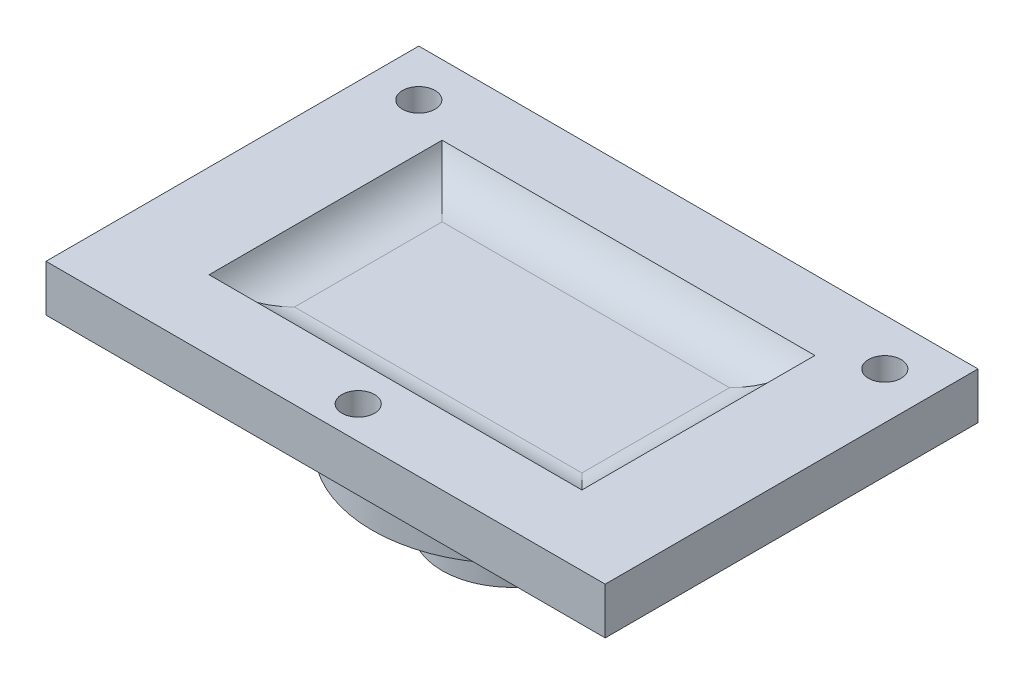
ISO-10303-21;
HEADER;
FILE_DESCRIPTION(('STEP AP214'),'2;1');
FILE_NAME('part.step','',(''),(''),'','','');
FILE_SCHEMA(('AUTOMOTIVE_DESIGN { 1 0 10303 214 1 1 1 1 }'));
ENDSEC;
DATA;
#1=APPLICATION_CONTEXT('core data for automotive mechanical design processes');
#2=APPLICATION_PROTOCOL_DEFINITION('international standard','automotive_design',2000,#1);
#3=PRODUCT_CONTEXT('',#1,'mechanical');
#4=PRODUCT('Part','Part','',(#3));
#5=PRODUCT_RELATED_PRODUCT_CATEGORY('part','',(#4));
#6=PRODUCT_DEFINITION_FORMATION('','',#4);
#7=PRODUCT_DEFINITION_CONTEXT('part definition',#1,'design');
#8=PRODUCT_DEFINITION('design','',#6,#7);
#9=PRODUCT_DEFINITION_SHAPE('','',#8);
#10=(LENGTH_UNIT() NAMED_UNIT(*) SI_UNIT(.MILLI.,.METRE.));
#11=(NAMED_UNIT(*) PLANE_ANGLE_UNIT() SI_UNIT($,.RADIAN.));
#12=(NAMED_UNIT(*) SI_UNIT($,.STERADIAN.) SOLID_ANGLE_UNIT());
#13=UNCERTAINTY_MEASURE_WITH_UNIT(LENGTH_MEASURE(1.E-05),#10,'distance_accuracy_value','');
#14=(GEOMETRIC_REPRESENTATION_CONTEXT(3) GLOBAL_UNCERTAINTY_ASSIGNED_CONTEXT((#13)) GLOBAL_UNIT_ASSIGNED_CONTEXT((#10,
#11,#12)) REPRESENTATION_CONTEXT('',''));
#15=CARTESIAN_POINT('',(0.,0.,0.));
#16=DIRECTION('',(0.,0.,1.));
#17=DIRECTION('',(1.,0.,0.));
#18=AXIS2_PLACEMENT_3D('',#15,#16,#17);
#19=CARTESIAN_POINT('',(39.2808364101075,-30.0000000000003,-1.14620291727828E-12));
#20=DIRECTION('',(0.,-1.,0.));
#21=DIRECTION('',(0.,0.,-1.));
#22=AXIS2_PLACEMENT_3D('',#19,#20,#21);
#23=PLANE('',#22);
#24=CARTESIAN_POINT('',(39.2808364101075,-30.,10.118912604795));
#25=DIRECTION('',(0.,1.,0.));
#26=DIRECTION('',(0.,0.,1.));
#27=AXIS2_PLACEMENT_3D('',#24,#25,#26);
#28=CIRCLE('',#27,15.);
#29=CARTESIAN_POINT('',(39.2808364101075,-30.0000000000001,25.1189126047949));
#30=VERTEX_POINT('',#29);
#31=EDGE_CURVE('E11',#30,#30,#28,.T.);
#32=ORIENTED_EDGE('',*,*,#31,.F.);
#33=EDGE_LOOP('',(#32));
#34=FACE_BOUND('',#33,.T.);
#35=ADVANCED_FACE('F51',(#34),#23,.T.);
#36=CARTESIAN_POINT('',(39.2808364101075,27.7078151186478,10.1189126047951));
#37=DIRECTION('',(0.,1.,0.));
#38=DIRECTION('',(0.,0.,1.));
#39=AXIS2_PLACEMENT_3D('',#36,#37,#38);
#40=CYLINDRICAL_SURFACE('',#39,15.);
#41=ORIENTED_EDGE('',*,*,#31,.T.);
#42=EDGE_LOOP('',(#41));
#43=FACE_BOUND('',#42,.T.);
#44=CARTESIAN_POINT('',(39.2808364101075,-15.,10.118912604795));
#45=DIRECTION('',(0.,1.,0.));
#46=DIRECTION('',(0.,0.,1.));
#47=AXIS2_PLACEMENT_3D('',#44,#45,#46);
#48=CIRCLE('',#47,15.);
#49=CARTESIAN_POINT('',(39.2808364101075,-15.0000000000001,25.118912604795));
#50=VERTEX_POINT('',#49);
#51=EDGE_CURVE('E57',#50,#50,#48,.T.);
#52=ORIENTED_EDGE('',*,*,#51,.F.);
#53=EDGE_LOOP('',(#52));
#54=FACE_BOUND('',#53,.T.);
#55=ADVANCED_FACE('F83',(#43,#54),#40,.T.);
#56=CARTESIAN_POINT('',(39.2808364101075,-15.,0.));
#57=DIRECTION('',(0.,-1.,0.));
#58=DIRECTION('',(0.,0.,-1.));
#59=AXIS2_PLACEMENT_3D('',#56,#57,#58);
#60=PLANE('',#59);
#61=ORIENTED_EDGE('',*,*,#51,.T.);
#62=EDGE_LOOP('',(#61));
#63=FACE_BOUND('',#62,.T.);
#64=CARTESIAN_POINT('',(39.2808364101075,-15.0000000000001,10.118912604795));
#65=DIRECTION('',(0.,1.,0.));
#66=DIRECTION('',(0.,0.,1.));
#67=AXIS2_PLACEMENT_3D('',#64,#65,#66);
#68=CIRCLE('',#67,29.9999999999999);
#69=CARTESIAN_POINT('',(39.2808364101075,-15.0000000000001,40.1189126047949));
#70=VERTEX_POINT('',#69);
#71=EDGE_CURVE('E61',#70,#70,#68,.T.);
#72=ORIENTED_EDGE('',*,*,#71,.F.);
#73=EDGE_LOOP('',(#72));
#74=FACE_BOUND('',#73,.T.);
#75=ADVANCED_FACE('F75',(#63,#74),#60,.T.);
#76=CARTESIAN_POINT('',(39.2808364101075,27.7078151186478,10.1189126047951));
#77=DIRECTION('',(0.,1.,0.));
#78=DIRECTION('',(0.,0.,1.));
#79=AXIS2_PLACEMENT_3D('',#76,#77,#78);
#80=CYLINDRICAL_SURFACE('',#79,29.9999999999999);
#81=ORIENTED_EDGE('',*,*,#71,.T.);
#82=EDGE_LOOP('',(#81));
#83=FACE_BOUND('',#82,.T.);
#84=CARTESIAN_POINT('',(39.2808364101075,0.,10.118912604795));
#85=DIRECTION('',(0.,1.,0.));
#86=DIRECTION('',(0.,0.,1.));
#87=AXIS2_PLACEMENT_3D('',#84,#85,#86);
#88=CIRCLE('',#87,29.9999999999999);
#89=CARTESIAN_POINT('',(39.2808364101075,-1.04100264772111E-13,40.118912604795));
#90=VERTEX_POINT('',#89);
#91=EDGE_CURVE('E65',#90,#90,#88,.T.);
#92=ORIENTED_EDGE('',*,*,#91,.F.);
#93=EDGE_LOOP('',(#92));
#94=FACE_BOUND('',#93,.T.);
#95=ADVANCED_FACE('F73',(#83,#94),#80,.T.);
#96=CARTESIAN_POINT('',(39.2808364101075,0.,0.));
#97=DIRECTION('',(0.,-1.,0.));
#98=DIRECTION('',(0.,0.,-1.));
#99=AXIS2_PLACEMENT_3D('',#96,#97,#98);
#100=PLANE('',#99);
#101=ORIENTED_EDGE('',*,*,#91,.T.);
#102=EDGE_LOOP('',(#101));
#103=FACE_BOUND('',#102,.T.);
#104=ADVANCED_FACE('F71',(#103),#100,.F.);
#105=CLOSED_SHELL('',(#35,#55,#75,#95,#104));
#106=MANIFOLD_SOLID_BREP('B2',#105);
#107=CARTESIAN_POINT('',(-20.7191635898925,10.,-29.881087395205));
#108=DIRECTION('',(1.,0.,0.));
#109=DIRECTION('',(0.,0.,-1.));
#110=AXIS2_PLACEMENT_3D('',#107,#108,#109);
#111=PLANE('',#110);
#112=DIRECTION('',(0.,0.,1.));
#113=VECTOR('',#112,1.);
#114=CARTESIAN_POINT('',(-20.7191635898925,0.,-29.881087395205));
#115=LINE('',#114,#113);
#116=CARTESIAN_POINT('',(-20.7191635898925,0.,-29.881087395205));
#117=VERTEX_POINT('',#116);
#118=CARTESIAN_POINT('',(-20.7191635898925,0.,50.118912604795));
#119=VERTEX_POINT('',#118);
#120=EDGE_CURVE('E225',#117,#119,#115,.T.);
#121=ORIENTED_EDGE('',*,*,#120,.T.);
#122=DIRECTION('',(0.,-1.,0.));
#123=VECTOR('',#122,1.);
#124=CARTESIAN_POINT('',(-20.7191635898925,10.,50.118912604795));
#125=LINE('',#124,#123);
#126=CARTESIAN_POINT('',(-20.7191635898925,10.,50.118912604795));
#127=VERTEX_POINT('',#126);
#128=EDGE_CURVE('E252',#127,#119,#125,.T.);
#129=ORIENTED_EDGE('',*,*,#128,.F.);
#130=DIRECTION('',(0.,0.,1.));
#131=VECTOR('',#130,1.);
#132=CARTESIAN_POINT('',(-20.7191635898925,10.,-29.881087395205));
#133=LINE('',#132,#131);
#134=CARTESIAN_POINT('',(-20.7191635898925,10.,-29.881087395205));
#135=VERTEX_POINT('',#134);
#136=EDGE_CURVE('E226',#135,#127,#133,.T.);
#137=ORIENTED_EDGE('',*,*,#136,.F.);
#138=DIRECTION('',(0.,-1.,0.));
#139=VECTOR('',#138,1.);
#140=CARTESIAN_POINT('',(-20.7191635898925,10.,-29.881087395205));
#141=LINE('',#140,#139);
#142=EDGE_CURVE('E236',#135,#117,#141,.T.);
#143=ORIENTED_EDGE('',*,*,#142,.T.);
#144=EDGE_LOOP('',(#121,#129,#137,#143));
#145=FACE_BOUND('',#144,.T.);
#146=ADVANCED_FACE('F125',(#145),#111,.F.);
#147=CARTESIAN_POINT('',(-20.7191635898925,10.,50.118912604795));
#148=DIRECTION('',(0.,0.,-1.));
#149=DIRECTION('',(-1.,0.,0.));
#150=AXIS2_PLACEMENT_3D('',#147,#148,#149);
#151=PLANE('',#150);
#152=DIRECTION('',(1.,0.,0.));
#153=VECTOR('',#152,1.);
#154=CARTESIAN_POINT('',(-20.7191635898925,0.,50.118912604795));
#155=LINE('',#154,#153);
#156=CARTESIAN_POINT('',(99.2808364101075,0.,50.118912604795));
#157=VERTEX_POINT('',#156);
#158=EDGE_CURVE('E239',#119,#157,#155,.T.);
#159=ORIENTED_EDGE('',*,*,#158,.T.);
#160=DIRECTION('',(0.,-1.,0.));
#161=VECTOR('',#160,1.);
#162=CARTESIAN_POINT('',(99.2808364101075,10.,50.118912604795));
#163=LINE('',#162,#161);
#164=CARTESIAN_POINT('',(99.2808364101075,10.,50.118912604795));
#165=VERTEX_POINT('',#164);
#166=EDGE_CURVE('E249',#165,#157,#163,.T.);
#167=ORIENTED_EDGE('',*,*,#166,.F.);
#168=DIRECTION('',(1.,0.,0.));
#169=VECTOR('',#168,1.);
#170=CARTESIAN_POINT('',(-20.7191635898925,10.,50.118912604795));
#171=LINE('',#170,#169);
#172=EDGE_CURVE('E229',#127,#165,#171,.T.);
#173=ORIENTED_EDGE('',*,*,#172,.F.);
#174=ORIENTED_EDGE('',*,*,#128,.T.);
#175=EDGE_LOOP('',(#159,#167,#173,#174));
#176=FACE_BOUND('',#175,.T.);
#177=ADVANCED_FACE('F268',(#176),#151,.F.);
#178=CARTESIAN_POINT('',(99.2808364101075,10.,-29.881087395205));
#179=DIRECTION('',(-1.,0.,0.));
#180=DIRECTION('',(0.,0.,1.));
#181=AXIS2_PLACEMENT_3D('',#178,#179,#180);
#182=PLANE('',#181);
#183=DIRECTION('',(0.,0.,-1.));
#184=VECTOR('',#183,1.);
#185=CARTESIAN_POINT('',(99.2808364101075,0.,-29.881087395205));
#186=LINE('',#185,#184);
#187=CARTESIAN_POINT('',(99.2808364101075,0.,-29.881087395205));
#188=VERTEX_POINT('',#187);
#189=EDGE_CURVE('E241',#157,#188,#186,.T.);
#190=ORIENTED_EDGE('',*,*,#189,.T.);
#191=DIRECTION('',(0.,-1.,0.));
#192=VECTOR('',#191,1.);
#193=CARTESIAN_POINT('',(99.2808364101075,10.,-29.881087395205));
#194=LINE('',#193,#192);
#195=CARTESIAN_POINT('',(99.2808364101075,10.,-29.881087395205));
#196=VERTEX_POINT('',#195);
#197=EDGE_CURVE('E246',#196,#188,#194,.T.);
#198=ORIENTED_EDGE('',*,*,#197,.F.);
#199=DIRECTION('',(0.,0.,-1.));
#200=VECTOR('',#199,1.);
#201=CARTESIAN_POINT('',(99.2808364101075,10.,-29.881087395205));
#202=LINE('',#201,#200);
#203=EDGE_CURVE('E232',#165,#196,#202,.T.);
#204=ORIENTED_EDGE('',*,*,#203,.F.);
#205=ORIENTED_EDGE('',*,*,#166,.T.);
#206=EDGE_LOOP('',(#190,#198,#204,#205));
#207=FACE_BOUND('',#206,.T.);
#208=ADVANCED_FACE('F274',(#207),#182,.F.);
#209=CARTESIAN_POINT('',(-20.7191635898925,10.,-29.881087395205));
#210=DIRECTION('',(0.,0.,1.));
#211=DIRECTION('',(1.,0.,0.));
#212=AXIS2_PLACEMENT_3D('',#209,#210,#211);
#213=PLANE('',#212);
#214=DIRECTION('',(-1.,0.,0.));
#215=VECTOR('',#214,1.);
#216=CARTESIAN_POINT('',(-20.7191635898925,0.,-29.881087395205));
#217=LINE('',#216,#215);
#218=EDGE_CURVE('E230',#188,#117,#217,.T.);
#219=ORIENTED_EDGE('',*,*,#218,.T.);
#220=ORIENTED_EDGE('',*,*,#142,.F.);
#221=DIRECTION('',(-1.,0.,0.));
#222=VECTOR('',#221,1.);
#223=CARTESIAN_POINT('',(-20.7191635898925,10.,-29.881087395205));
#224=LINE('',#223,#222);
#225=EDGE_CURVE('E234',#196,#135,#224,.T.);
#226=ORIENTED_EDGE('',*,*,#225,.F.);
#227=ORIENTED_EDGE('',*,*,#197,.T.);
#228=EDGE_LOOP('',(#219,#220,#226,#227));
#229=FACE_BOUND('',#228,.T.);
#230=ADVANCED_FACE('F302',(#229),#213,.F.);
#231=CARTESIAN_POINT('',(0.,10.,0.));
#232=DIRECTION('',(0.,1.,0.));
#233=DIRECTION('',(0.,0.,1.));
#234=AXIS2_PLACEMENT_3D('',#231,#232,#233);
#235=PLANE('',#234);
#236=CARTESIAN_POINT('',(-10.7191635898925,10.,-19.881087395205));
#237=DIRECTION('',(0.,1.,0.));
#238=DIRECTION('',(0.,0.,1.));
#239=AXIS2_PLACEMENT_3D('',#236,#237,#238);
#240=CIRCLE('',#239,3.49999999999999);
#241=CARTESIAN_POINT('',(-10.7191635898925,10.,-16.381087395205));
#242=VERTEX_POINT('',#241);
#243=EDGE_CURVE('E414',#242,#242,#240,.T.);
#244=ORIENTED_EDGE('',*,*,#243,.F.);
#245=EDGE_LOOP('',(#244));
#246=FACE_BOUND('',#245,.T.);
#247=CARTESIAN_POINT('',(89.2808364101075,10.,-19.881087395205));
#248=DIRECTION('',(0.,1.,0.));
#249=DIRECTION('',(0.,0.,1.));
#250=AXIS2_PLACEMENT_3D('',#247,#248,#249);
#251=CIRCLE('',#250,3.49999999999999);
#252=CARTESIAN_POINT('',(89.2808364101075,10.,-16.381087395205));
#253=VERTEX_POINT('',#252);
#254=EDGE_CURVE('E416',#253,#253,#251,.T.);
#255=ORIENTED_EDGE('',*,*,#254,.F.);
#256=EDGE_LOOP('',(#255));
#257=FACE_BOUND('',#256,.T.);
#258=CARTESIAN_POINT('',(39.2808364101075,10.,43.118912604795));
#259=DIRECTION('',(0.,1.,0.));
#260=DIRECTION('',(0.,0.,1.));
#261=AXIS2_PLACEMENT_3D('',#258,#259,#260);
#262=CIRCLE('',#261,3.49999999999999);
#263=CARTESIAN_POINT('',(39.2808364101075,10.,46.618912604795));
#264=VERTEX_POINT('',#263);
#265=EDGE_CURVE('E214',#264,#264,#262,.T.);
#266=ORIENTED_EDGE('',*,*,#265,.F.);
#267=EDGE_LOOP('',(#266));
#268=FACE_BOUND('',#267,.T.);
#269=DIRECTION('',(0.,0.,1.));
#270=VECTOR('',#269,1.);
#271=CARTESIAN_POINT('',(-0.719163589892477,10.,-14.881087395205));
#272=LINE('',#271,#270);
#273=CARTESIAN_POINT('',(-0.719163589892477,10.,-14.881087395205));
#274=VERTEX_POINT('',#273);
#275=CARTESIAN_POINT('',(-0.719163589892471,10.,35.118912604795));
#276=VERTEX_POINT('',#275);
#277=EDGE_CURVE('E206',#274,#276,#272,.T.);
#278=ORIENTED_EDGE('',*,*,#277,.F.);
#279=DIRECTION('',(-1.,0.,0.));
#280=VECTOR('',#279,1.);
#281=CARTESIAN_POINT('',(-0.719163589892477,10.,-14.881087395205));
#282=LINE('',#281,#280);
#283=CARTESIAN_POINT('',(79.2808364101075,10.,-14.881087395205));
#284=VERTEX_POINT('',#283);
#285=EDGE_CURVE('E197',#284,#274,#282,.T.);
#286=ORIENTED_EDGE('',*,*,#285,.F.);
#287=DIRECTION('',(0.,0.,-1.));
#288=VECTOR('',#287,1.);
#289=CARTESIAN_POINT('',(79.2808364101075,10.,-14.881087395205));
#290=LINE('',#289,#288);
#291=CARTESIAN_POINT('',(79.2808364101075,10.,35.118912604795));
#292=VERTEX_POINT('',#291);
#293=EDGE_CURVE('E192',#292,#284,#290,.T.);
#294=ORIENTED_EDGE('',*,*,#293,.F.);
#295=DIRECTION('',(1.,0.,0.));
#296=VECTOR('',#295,1.);
#297=CARTESIAN_POINT('',(-0.719163589892471,10.,35.118912604795));
#298=LINE('',#297,#296);
#299=EDGE_CURVE('E195',#276,#292,#298,.T.);
#300=ORIENTED_EDGE('',*,*,#299,.F.);
#301=EDGE_LOOP('',(#278,#286,#294,#300));
#302=FACE_BOUND('',#301,.T.);
#303=ORIENTED_EDGE('',*,*,#136,.T.);
#304=ORIENTED_EDGE('',*,*,#172,.T.);
#305=ORIENTED_EDGE('',*,*,#203,.T.);
#306=ORIENTED_EDGE('',*,*,#225,.T.);
#307=EDGE_LOOP('',(#303,#304,#305,#306));
#308=FACE_BOUND('',#307,.T.);
#309=ADVANCED_FACE('F193',(#246,#257,#268,#302,#308),#235,.T.);
#310=CARTESIAN_POINT('',(0.,0.,0.));
#311=DIRECTION('',(0.,1.,0.));
#312=DIRECTION('',(0.,0.,1.));
#313=AXIS2_PLACEMENT_3D('',#310,#311,#312);
#314=PLANE('',#313);
#315=CARTESIAN_POINT('',(-10.7191635898925,0.,-19.881087395205));
#316=DIRECTION('',(0.,1.,0.));
#317=DIRECTION('',(0.,0.,1.));
#318=AXIS2_PLACEMENT_3D('',#315,#316,#317);
#319=CIRCLE('',#318,3.49999999999999);
#320=CARTESIAN_POINT('',(-10.7191635898925,0.,-16.381087395205));
#321=VERTEX_POINT('',#320);
#322=EDGE_CURVE('E411',#321,#321,#319,.T.);
#323=ORIENTED_EDGE('',*,*,#322,.T.);
#324=EDGE_LOOP('',(#323));
#325=FACE_BOUND('',#324,.T.);
#326=CARTESIAN_POINT('',(89.2808364101075,0.,-19.881087395205));
#327=DIRECTION('',(0.,1.,0.));
#328=DIRECTION('',(0.,0.,1.));
#329=AXIS2_PLACEMENT_3D('',#326,#327,#328);
#330=CIRCLE('',#329,3.5);
#331=CARTESIAN_POINT('',(89.2808364101075,0.,-16.381087395205));
#332=VERTEX_POINT('',#331);
#333=EDGE_CURVE('E421',#332,#332,#330,.T.);
#334=ORIENTED_EDGE('',*,*,#333,.T.);
#335=EDGE_LOOP('',(#334));
#336=FACE_BOUND('',#335,.T.);
#337=CARTESIAN_POINT('',(39.2808364101075,0.,43.118912604795));
#338=DIRECTION('',(0.,1.,0.));
#339=DIRECTION('',(0.,0.,1.));
#340=AXIS2_PLACEMENT_3D('',#337,#338,#339);
#341=CIRCLE('',#340,3.49999999999999);
#342=CARTESIAN_POINT('',(39.2808364101075,0.,46.618912604795));
#343=VERTEX_POINT('',#342);
#344=EDGE_CURVE('E209',#343,#343,#341,.T.);
#345=ORIENTED_EDGE('',*,*,#344,.T.);
#346=EDGE_LOOP('',(#345));
#347=FACE_BOUND('',#346,.T.);
#348=ORIENTED_EDGE('',*,*,#120,.F.);
#349=ORIENTED_EDGE('',*,*,#218,.F.);
#350=ORIENTED_EDGE('',*,*,#189,.F.);
#351=ORIENTED_EDGE('',*,*,#158,.F.);
#352=EDGE_LOOP('',(#348,#349,#350,#351));
#353=FACE_BOUND('',#352,.T.);
#354=ADVANCED_FACE('F299',(#325,#336,#347,#353),#314,.F.);
#355=CARTESIAN_POINT('',(0.,4.,0.));
#356=DIRECTION('',(0.,1.,0.));
#357=DIRECTION('',(0.,0.,1.));
#358=AXIS2_PLACEMENT_3D('',#355,#356,#357);
#359=PLANE('',#358);
#360=DIRECTION('',(0.,0.,1.));
#361=VECTOR('',#360,1.);
#362=CARTESIAN_POINT('',(8.44598780001921,4.,35.118912604795));
#363=LINE('',#362,#361);
#364=CARTESIAN_POINT('',(8.44598780001921,4.,-5.71593600529334));
#365=VERTEX_POINT('',#364);
#366=CARTESIAN_POINT('',(8.44598780001921,4.,25.9537612148833));
#367=VERTEX_POINT('',#366);
#368=EDGE_CURVE('E255',#365,#367,#363,.T.);
#369=ORIENTED_EDGE('',*,*,#368,.T.);
#370=DIRECTION('',(1.,0.,0.));
#371=VECTOR('',#370,1.);
#372=CARTESIAN_POINT('',(79.2808364101075,4.,25.9537612148833));
#373=LINE('',#372,#371);
#374=CARTESIAN_POINT('',(70.1156850201958,4.,25.9537612148833));
#375=VERTEX_POINT('',#374);
#376=EDGE_CURVE('E49',#367,#375,#373,.T.);
#377=ORIENTED_EDGE('',*,*,#376,.T.);
#378=DIRECTION('',(0.,0.,-1.));
#379=VECTOR('',#378,1.);
#380=CARTESIAN_POINT('',(70.1156850201958,4.,-14.881087395205));
#381=LINE('',#380,#379);
#382=CARTESIAN_POINT('',(70.1156850201958,4.,-5.71593600529334));
#383=VERTEX_POINT('',#382);
#384=EDGE_CURVE('E134',#375,#383,#381,.T.);
#385=ORIENTED_EDGE('',*,*,#384,.T.);
#386=DIRECTION('',(-1.,0.,0.));
#387=VECTOR('',#386,1.);
#388=CARTESIAN_POINT('',(-0.719163589892477,4.,-5.71593600529334));
#389=LINE('',#388,#387);
#390=EDGE_CURVE('E257',#383,#365,#389,.T.);
#391=ORIENTED_EDGE('',*,*,#390,.T.);
#392=EDGE_LOOP('',(#369,#377,#385,#391));
#393=FACE_BOUND('',#392,.T.);
#394=ADVANCED_FACE('F258',(#393),#359,.T.);
#395=CARTESIAN_POINT('',(-0.719163589892477,14.,-5.71593600529334));
#396=DIRECTION('',(1.,0.,0.));
#397=DIRECTION('',(0.,0.,-1.));
#398=AXIS2_PLACEMENT_3D('',#395,#396,#397);
#399=CYLINDRICAL_SURFACE('',#398,10.);
#400=CARTESIAN_POINT('',(70.1156850201958,14.,-5.71593600529334));
#401=DIRECTION('',(0.707106781186547,0.,0.707106781186547));
#402=DIRECTION('',(-0.707106781186547,0.,0.707106781186547));
#403=AXIS2_PLACEMENT_3D('',#400,#401,#402);
#404=ELLIPSE('',#403,14.1421356237309,10.);
#405=EDGE_CURVE('E211',#284,#383,#404,.F.);
#406=ORIENTED_EDGE('',*,*,#405,.F.);
#407=ORIENTED_EDGE('',*,*,#285,.T.);
#408=CARTESIAN_POINT('',(8.44598780001921,14.,-5.71593600529334));
#409=DIRECTION('',(0.707106781186547,0.,-0.707106781186548));
#410=DIRECTION('',(0.707106781186548,0.,0.707106781186547));
#411=AXIS2_PLACEMENT_3D('',#408,#409,#410);
#412=ELLIPSE('',#411,14.142135623731,10.);
#413=EDGE_CURVE('E129',#365,#274,#412,.T.);
#414=ORIENTED_EDGE('',*,*,#413,.F.);
#415=ORIENTED_EDGE('',*,*,#390,.F.);
#416=EDGE_LOOP('',(#406,#407,#414,#415));
#417=FACE_BOUND('',#416,.T.);
#418=ADVANCED_FACE('F127',(#417),#399,.F.);
#419=CARTESIAN_POINT('',(8.4459878000192,14.,-14.881087395205));
#420=DIRECTION('',(0.,0.,-1.));
#421=DIRECTION('',(-1.,0.,0.));
#422=AXIS2_PLACEMENT_3D('',#419,#420,#421);
#423=CYLINDRICAL_SURFACE('',#422,10.);
#424=ORIENTED_EDGE('',*,*,#413,.T.);
#425=ORIENTED_EDGE('',*,*,#277,.T.);
#426=CARTESIAN_POINT('',(8.44598780001921,14.,25.9537612148833));
#427=DIRECTION('',(-0.707106781186548,0.,-0.707106781186547));
#428=DIRECTION('',(-0.707106781186547,0.,0.707106781186548));
#429=AXIS2_PLACEMENT_3D('',#426,#427,#428);
#430=ELLIPSE('',#429,14.1421356237309,10.);
#431=EDGE_CURVE('E204',#367,#276,#430,.T.);
#432=ORIENTED_EDGE('',*,*,#431,.F.);
#433=ORIENTED_EDGE('',*,*,#368,.F.);
#434=EDGE_LOOP('',(#424,#425,#432,#433));
#435=FACE_BOUND('',#434,.T.);
#436=ADVANCED_FACE('F260',(#435),#423,.F.);
#437=CARTESIAN_POINT('',(70.1156850201958,14.,-14.881087395205));
#438=DIRECTION('',(0.,0.,1.));
#439=DIRECTION('',(1.,0.,0.));
#440=AXIS2_PLACEMENT_3D('',#437,#438,#439);
#441=CYLINDRICAL_SURFACE('',#440,10.);
#442=ORIENTED_EDGE('',*,*,#405,.T.);
#443=ORIENTED_EDGE('',*,*,#384,.F.);
#444=CARTESIAN_POINT('',(70.1156850201958,14.,25.9537612148833));
#445=DIRECTION('',(-0.707106781186547,0.,0.707106781186547));
#446=DIRECTION('',(-0.707106781186547,0.,-0.707106781186547));
#447=AXIS2_PLACEMENT_3D('',#444,#445,#446);
#448=ELLIPSE('',#447,14.1421356237309,10.);
#449=EDGE_CURVE('E142',#292,#375,#448,.F.);
#450=ORIENTED_EDGE('',*,*,#449,.F.);
#451=ORIENTED_EDGE('',*,*,#293,.T.);
#452=EDGE_LOOP('',(#442,#443,#450,#451));
#453=FACE_BOUND('',#452,.T.);
#454=ADVANCED_FACE('F208',(#453),#441,.F.);
#455=CARTESIAN_POINT('',(-0.719163589892471,14.,25.9537612148833));
#456=DIRECTION('',(-1.,0.,0.));
#457=DIRECTION('',(0.,0.,1.));
#458=AXIS2_PLACEMENT_3D('',#455,#456,#457);
#459=CYLINDRICAL_SURFACE('',#458,10.);
#460=ORIENTED_EDGE('',*,*,#431,.T.);
#461=ORIENTED_EDGE('',*,*,#299,.T.);
#462=ORIENTED_EDGE('',*,*,#449,.T.);
#463=ORIENTED_EDGE('',*,*,#376,.F.);
#464=EDGE_LOOP('',(#460,#461,#462,#463));
#465=FACE_BOUND('',#464,.T.);
#466=ADVANCED_FACE('F202',(#465),#459,.F.);
#467=CARTESIAN_POINT('',(39.2808364101075,10.,43.118912604795));
#468=DIRECTION('',(0.,1.,0.));
#469=DIRECTION('',(0.,0.,1.));
#470=AXIS2_PLACEMENT_3D('',#467,#468,#469);
#471=CYLINDRICAL_SURFACE('',#470,3.49999999999999);
#472=ORIENTED_EDGE('',*,*,#344,.F.);
#473=EDGE_LOOP('',(#472));
#474=FACE_BOUND('',#473,.T.);
#475=ORIENTED_EDGE('',*,*,#265,.T.);
#476=EDGE_LOOP('',(#475));
#477=FACE_BOUND('',#476,.T.);
#478=ADVANCED_FACE('F280',(#474,#477),#471,.F.);
#479=CARTESIAN_POINT('',(89.2808364101075,10.,-19.881087395205));
#480=DIRECTION('',(0.,1.,0.));
#481=DIRECTION('',(0.,0.,1.));
#482=AXIS2_PLACEMENT_3D('',#479,#480,#481);
#483=CYLINDRICAL_SURFACE('',#482,3.5);
#484=ORIENTED_EDGE('',*,*,#333,.F.);
#485=EDGE_LOOP('',(#484));
#486=FACE_BOUND('',#485,.T.);
#487=ORIENTED_EDGE('',*,*,#254,.T.);
#488=EDGE_LOOP('',(#487));
#489=FACE_BOUND('',#488,.T.);
#490=ADVANCED_FACE('F284',(#486,#489),#483,.F.);
#491=CARTESIAN_POINT('',(-10.7191635898925,10.,-19.881087395205));
#492=DIRECTION('',(0.,1.,0.));
#493=DIRECTION('',(0.,0.,1.));
#494=AXIS2_PLACEMENT_3D('',#491,#492,#493);
#495=CYLINDRICAL_SURFACE('',#494,3.49999999999999);
#496=ORIENTED_EDGE('',*,*,#322,.F.);
#497=EDGE_LOOP('',(#496));
#498=FACE_BOUND('',#497,.T.);
#499=ORIENTED_EDGE('',*,*,#243,.T.);
#500=EDGE_LOOP('',(#499));
#501=FACE_BOUND('',#500,.T.);
#502=ADVANCED_FACE('F290',(#498,#501),#495,.F.);
#503=CLOSED_SHELL('',(#146,#177,#208,#230,#309,#354,#394,#418,#436,#454,#466,#478,#490,#502));
#504=MANIFOLD_SOLID_BREP('B6',#503);
#505=ADVANCED_BREP_SHAPE_REPRESENTATION('',(#18,#106,#504),#14);
#506=SHAPE_DEFINITION_REPRESENTATION(#9,#505);
ENDSEC;
END-ISO-10303-21;
